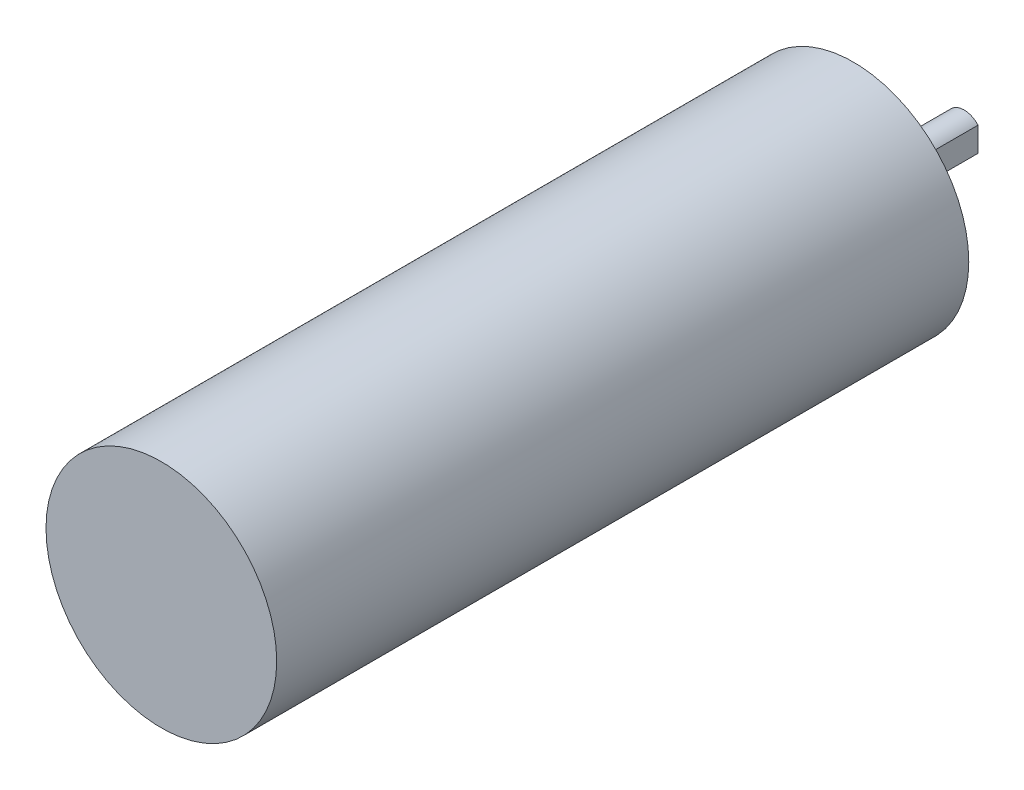
ISO-10303-21;
HEADER;
FILE_DESCRIPTION(('STEP AP214'),'2;1');
FILE_NAME('part.step','',(''),(''),'','','');
FILE_SCHEMA(('AUTOMOTIVE_DESIGN { 1 0 10303 214 1 1 1 1 }'));
ENDSEC;
DATA;
#1=APPLICATION_CONTEXT('core data for automotive mechanical design processes');
#2=APPLICATION_PROTOCOL_DEFINITION('international standard','automotive_design',2000,#1);
#3=PRODUCT_CONTEXT('',#1,'mechanical');
#4=PRODUCT('Part','Part','',(#3));
#5=PRODUCT_RELATED_PRODUCT_CATEGORY('part','',(#4));
#6=PRODUCT_DEFINITION_FORMATION('','',#4);
#7=PRODUCT_DEFINITION_CONTEXT('part definition',#1,'design');
#8=PRODUCT_DEFINITION('design','',#6,#7);
#9=PRODUCT_DEFINITION_SHAPE('','',#8);
#10=(LENGTH_UNIT() NAMED_UNIT(*) SI_UNIT(.MILLI.,.METRE.));
#11=(NAMED_UNIT(*) PLANE_ANGLE_UNIT() SI_UNIT($,.RADIAN.));
#12=(NAMED_UNIT(*) SI_UNIT($,.STERADIAN.) SOLID_ANGLE_UNIT());
#13=UNCERTAINTY_MEASURE_WITH_UNIT(LENGTH_MEASURE(1.E-05),#10,'distance_accuracy_value','');
#14=(GEOMETRIC_REPRESENTATION_CONTEXT(3) GLOBAL_UNCERTAINTY_ASSIGNED_CONTEXT((#13)) GLOBAL_UNIT_ASSIGNED_CONTEXT((#10,
#11,#12)) REPRESENTATION_CONTEXT('',''));
#15=CARTESIAN_POINT('',(0.,0.,0.));
#16=DIRECTION('',(0.,0.,1.));
#17=DIRECTION('',(1.,0.,0.));
#18=AXIS2_PLACEMENT_3D('',#15,#16,#17);
#19=CARTESIAN_POINT('',(0.,0.,12.));
#20=DIRECTION('',(0.,0.,-1.));
#21=DIRECTION('',(-1.,0.,0.));
#22=AXIS2_PLACEMENT_3D('',#19,#20,#21);
#23=CYLINDRICAL_SURFACE('',#22,2.);
#24=CARTESIAN_POINT('',(0.,0.,12.));
#25=DIRECTION('',(0.,0.,1.));
#26=DIRECTION('',(1.,0.,0.));
#27=AXIS2_PLACEMENT_3D('',#24,#25,#26);
#28=CIRCLE('',#27,2.);
#29=CARTESIAN_POINT('',(2.,0.,12.));
#30=VERTEX_POINT('',#29);
#31=EDGE_CURVE('E69',#30,#30,#28,.T.);
#32=ORIENTED_EDGE('',*,*,#31,.F.);
#33=EDGE_LOOP('',(#32));
#34=FACE_BOUND('',#33,.T.);
#35=DIRECTION('',(0.,0.,-1.));
#36=VECTOR('',#35,1.);
#37=CARTESIAN_POINT('',(1.5,-1.3228756555323,12.));
#38=LINE('',#37,#36);
#39=CARTESIAN_POINT('',(1.5,-1.3228756555323,10.));
#40=VERTEX_POINT('',#39);
#41=CARTESIAN_POINT('',(1.5,-1.3228756555323,0.));
#42=VERTEX_POINT('',#41);
#43=EDGE_CURVE('E53',#40,#42,#38,.T.);
#44=ORIENTED_EDGE('',*,*,#43,.F.);
#45=CARTESIAN_POINT('',(0.,0.,10.));
#46=DIRECTION('',(0.,0.,-1.));
#47=DIRECTION('',(-1.,0.,0.));
#48=AXIS2_PLACEMENT_3D('',#45,#46,#47);
#49=CIRCLE('',#48,2.);
#50=CARTESIAN_POINT('',(1.5,1.3228756555323,10.));
#51=VERTEX_POINT('',#50);
#52=EDGE_CURVE('E11',#51,#40,#49,.T.);
#53=ORIENTED_EDGE('',*,*,#52,.F.);
#54=DIRECTION('',(0.,0.,-1.));
#55=VECTOR('',#54,1.);
#56=CARTESIAN_POINT('',(1.5,1.3228756555323,12.));
#57=LINE('',#56,#55);
#58=CARTESIAN_POINT('',(1.5,1.3228756555323,0.));
#59=VERTEX_POINT('',#58);
#60=EDGE_CURVE('E65',#59,#51,#57,.F.);
#61=ORIENTED_EDGE('',*,*,#60,.F.);
#62=CARTESIAN_POINT('',(0.,0.,0.));
#63=DIRECTION('',(0.,0.,1.));
#64=DIRECTION('',(1.,0.,0.));
#65=AXIS2_PLACEMENT_3D('',#62,#63,#64);
#66=CIRCLE('',#65,2.);
#67=EDGE_CURVE('E71',#59,#42,#66,.T.);
#68=ORIENTED_EDGE('',*,*,#67,.T.);
#69=EDGE_LOOP('',(#44,#53,#61,#68));
#70=FACE_BOUND('',#69,.T.);
#71=ADVANCED_FACE('F39',(#34,#70),#23,.T.);
#72=CARTESIAN_POINT('',(0.,0.,0.));
#73=DIRECTION('',(0.,0.,1.));
#74=DIRECTION('',(1.,0.,0.));
#75=AXIS2_PLACEMENT_3D('',#72,#73,#74);
#76=PLANE('',#75);
#77=DIRECTION('',(0.,1.,0.));
#78=VECTOR('',#77,1.);
#79=CARTESIAN_POINT('',(1.5,0.,0.));
#80=LINE('',#79,#78);
#81=EDGE_CURVE('E46',#42,#59,#80,.T.);
#82=ORIENTED_EDGE('',*,*,#81,.F.);
#83=ORIENTED_EDGE('',*,*,#67,.F.);
#84=EDGE_LOOP('',(#82,#83));
#85=FACE_BOUND('',#84,.T.);
#86=ADVANCED_FACE('F74',(#85),#76,.F.);
#87=CARTESIAN_POINT('',(0.,0.,87.));
#88=DIRECTION('',(0.,0.,-1.));
#89=DIRECTION('',(-1.,0.,0.));
#90=AXIS2_PLACEMENT_3D('',#87,#88,#89);
#91=CYLINDRICAL_SURFACE('',#90,12.5);
#92=CARTESIAN_POINT('',(0.,0.,87.));
#93=DIRECTION('',(0.,0.,1.));
#94=DIRECTION('',(1.,0.,0.));
#95=AXIS2_PLACEMENT_3D('',#92,#93,#94);
#96=CIRCLE('',#95,12.5);
#97=CARTESIAN_POINT('',(12.5,0.,87.));
#98=VERTEX_POINT('',#97);
#99=EDGE_CURVE('E75',#98,#98,#96,.T.);
#100=ORIENTED_EDGE('',*,*,#99,.F.);
#101=EDGE_LOOP('',(#100));
#102=FACE_BOUND('',#101,.T.);
#103=CARTESIAN_POINT('',(0.,0.,12.));
#104=DIRECTION('',(0.,0.,1.));
#105=DIRECTION('',(1.,0.,0.));
#106=AXIS2_PLACEMENT_3D('',#103,#104,#105);
#107=CIRCLE('',#106,12.5);
#108=CARTESIAN_POINT('',(12.5,0.,12.));
#109=VERTEX_POINT('',#108);
#110=EDGE_CURVE('E80',#109,#109,#107,.T.);
#111=ORIENTED_EDGE('',*,*,#110,.T.);
#112=EDGE_LOOP('',(#111));
#113=FACE_BOUND('',#112,.T.);
#114=ADVANCED_FACE('F103',(#102,#113),#91,.T.);
#115=CARTESIAN_POINT('',(0.,0.,87.));
#116=DIRECTION('',(0.,0.,1.));
#117=DIRECTION('',(1.,0.,0.));
#118=AXIS2_PLACEMENT_3D('',#115,#116,#117);
#119=PLANE('',#118);
#120=ORIENTED_EDGE('',*,*,#99,.T.);
#121=EDGE_LOOP('',(#120));
#122=FACE_BOUND('',#121,.T.);
#123=ADVANCED_FACE('F96',(#122),#119,.T.);
#124=CARTESIAN_POINT('',(0.,0.,12.));
#125=DIRECTION('',(0.,0.,1.));
#126=DIRECTION('',(1.,0.,0.));
#127=AXIS2_PLACEMENT_3D('',#124,#125,#126);
#128=PLANE('',#127);
#129=ORIENTED_EDGE('',*,*,#31,.T.);
#130=EDGE_LOOP('',(#129));
#131=FACE_BOUND('',#130,.T.);
#132=ORIENTED_EDGE('',*,*,#110,.F.);
#133=EDGE_LOOP('',(#132));
#134=FACE_BOUND('',#133,.T.);
#135=ADVANCED_FACE('F88',(#131,#134),#128,.F.);
#136=CARTESIAN_POINT('',(0.,0.,10.));
#137=DIRECTION('',(0.,0.,-1.));
#138=DIRECTION('',(-1.,0.,0.));
#139=AXIS2_PLACEMENT_3D('',#136,#137,#138);
#140=PLANE('',#139);
#141=ORIENTED_EDGE('',*,*,#52,.T.);
#142=DIRECTION('',(0.,-1.,0.));
#143=VECTOR('',#142,1.);
#144=CARTESIAN_POINT('',(1.5,-3.,10.));
#145=LINE('',#144,#143);
#146=EDGE_CURVE('E72',#51,#40,#145,.T.);
#147=ORIENTED_EDGE('',*,*,#146,.F.);
#148=EDGE_LOOP('',(#141,#147));
#149=FACE_BOUND('',#148,.T.);
#150=ADVANCED_FACE('F86',(#149),#140,.T.);
#151=CARTESIAN_POINT('',(1.5,-3.,10.));
#152=DIRECTION('',(1.,0.,0.));
#153=DIRECTION('',(0.,0.,-1.));
#154=AXIS2_PLACEMENT_3D('',#151,#152,#153);
#155=PLANE('',#154);
#156=ORIENTED_EDGE('',*,*,#43,.T.);
#157=ORIENTED_EDGE('',*,*,#81,.T.);
#158=ORIENTED_EDGE('',*,*,#60,.T.);
#159=ORIENTED_EDGE('',*,*,#146,.T.);
#160=EDGE_LOOP('',(#156,#157,#158,#159));
#161=FACE_BOUND('',#160,.T.);
#162=ADVANCED_FACE('F64',(#161),#155,.T.);
#163=CLOSED_SHELL('',(#71,#86,#114,#123,#135,#150,#162));
#164=MANIFOLD_SOLID_BREP('B2',#163);
#165=ADVANCED_BREP_SHAPE_REPRESENTATION('',(#18,#164),#14);
#166=SHAPE_DEFINITION_REPRESENTATION(#9,#165);
ENDSEC;
END-ISO-10303-21;
